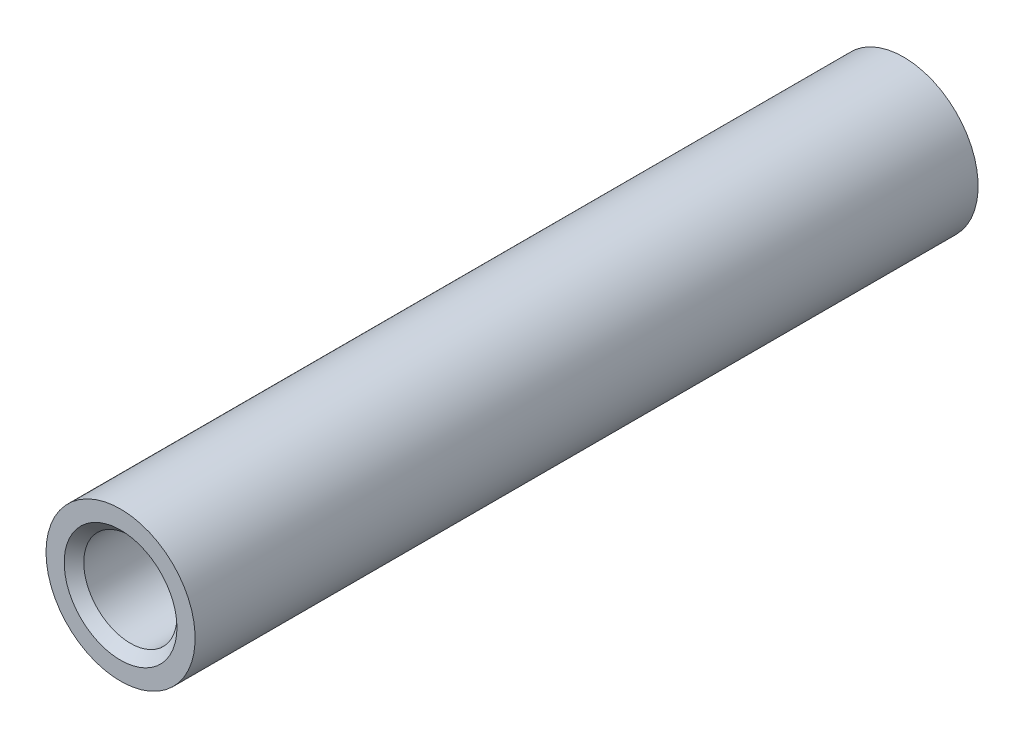
ISO-10303-21;
HEADER;
FILE_DESCRIPTION(('STEP AP214'),'2;1');
FILE_NAME('part.step','',(''),(''),'','','');
FILE_SCHEMA(('AUTOMOTIVE_DESIGN { 1 0 10303 214 1 1 1 1 }'));
ENDSEC;
DATA;
#1=APPLICATION_CONTEXT('core data for automotive mechanical design processes');
#2=APPLICATION_PROTOCOL_DEFINITION('international standard','automotive_design',2000,#1);
#3=PRODUCT_CONTEXT('',#1,'mechanical');
#4=PRODUCT('Part','Part','',(#3));
#5=PRODUCT_RELATED_PRODUCT_CATEGORY('part','',(#4));
#6=PRODUCT_DEFINITION_FORMATION('','',#4);
#7=PRODUCT_DEFINITION_CONTEXT('part definition',#1,'design');
#8=PRODUCT_DEFINITION('design','',#6,#7);
#9=PRODUCT_DEFINITION_SHAPE('','',#8);
#10=(LENGTH_UNIT() NAMED_UNIT(*) SI_UNIT(.MILLI.,.METRE.));
#11=(NAMED_UNIT(*) PLANE_ANGLE_UNIT() SI_UNIT($,.RADIAN.));
#12=(NAMED_UNIT(*) SI_UNIT($,.STERADIAN.) SOLID_ANGLE_UNIT());
#13=UNCERTAINTY_MEASURE_WITH_UNIT(LENGTH_MEASURE(1.E-05),#10,'distance_accuracy_value','');
#14=(GEOMETRIC_REPRESENTATION_CONTEXT(3) GLOBAL_UNCERTAINTY_ASSIGNED_CONTEXT((#13)) GLOBAL_UNIT_ASSIGNED_CONTEXT((#10,
#11,#12)) REPRESENTATION_CONTEXT('',''));
#15=CARTESIAN_POINT('',(0.,0.,0.));
#16=DIRECTION('',(0.,0.,1.));
#17=DIRECTION('',(1.,0.,0.));
#18=AXIS2_PLACEMENT_3D('',#15,#16,#17);
#19=CARTESIAN_POINT('',(0.,0.,21.));
#20=DIRECTION('',(0.,0.,-1.));
#21=DIRECTION('',(-1.,0.,0.));
#22=AXIS2_PLACEMENT_3D('',#19,#20,#21);
#23=CYLINDRICAL_SURFACE('',#22,4.);
#24=CARTESIAN_POINT('',(0.,0.,21.));
#25=DIRECTION('',(0.,0.,1.));
#26=DIRECTION('',(1.,0.,0.));
#27=AXIS2_PLACEMENT_3D('',#24,#25,#26);
#28=CIRCLE('',#27,4.);
#29=CARTESIAN_POINT('',(-4.,0.,21.));
#30=VERTEX_POINT('',#29);
#31=EDGE_CURVE('E11',#30,#30,#28,.T.);
#32=CARTESIAN_POINT('',(0.,0.,-21.));
#33=DIRECTION('',(0.,0.,1.));
#34=DIRECTION('',(1.,0.,0.));
#35=AXIS2_PLACEMENT_3D('',#32,#33,#34);
#36=CIRCLE('',#35,4.);
#37=CARTESIAN_POINT('',(-4.,0.,-21.));
#38=VERTEX_POINT('',#37);
#39=EDGE_CURVE('E39',#38,#38,#36,.T.);
#40=CARTESIAN_POINT('',(-4.,0.,21.));
#41=CARTESIAN_POINT('',(-4.,0.,20.5625));
#42=CARTESIAN_POINT('',(-4.,0.,20.125));
#43=CARTESIAN_POINT('',(-4.,0.,19.25));
#44=CARTESIAN_POINT('',(-4.,0.,18.8125));
#45=CARTESIAN_POINT('',(-4.,0.,17.9375));
#46=CARTESIAN_POINT('',(-4.,0.,17.5));
#47=CARTESIAN_POINT('',(-4.,0.,16.625));
#48=CARTESIAN_POINT('',(-4.,0.,16.1875));
#49=CARTESIAN_POINT('',(-4.,0.,15.3125));
#50=CARTESIAN_POINT('',(-4.,0.,14.875));
#51=CARTESIAN_POINT('',(-4.,0.,14.));
#52=CARTESIAN_POINT('',(-4.,0.,13.5625));
#53=CARTESIAN_POINT('',(-4.,0.,12.6875));
#54=CARTESIAN_POINT('',(-4.,0.,12.25));
#55=CARTESIAN_POINT('',(-4.,0.,11.375));
#56=CARTESIAN_POINT('',(-4.,0.,10.9375));
#57=CARTESIAN_POINT('',(-4.,0.,10.0625));
#58=CARTESIAN_POINT('',(-4.,0.,9.625));
#59=CARTESIAN_POINT('',(-4.,0.,8.75));
#60=CARTESIAN_POINT('',(-4.,0.,8.3125));
#61=CARTESIAN_POINT('',(-4.,0.,7.4375));
#62=CARTESIAN_POINT('',(-4.,0.,7.));
#63=CARTESIAN_POINT('',(-4.,0.,6.125));
#64=CARTESIAN_POINT('',(-4.,0.,5.6875));
#65=CARTESIAN_POINT('',(-4.,0.,4.8125));
#66=CARTESIAN_POINT('',(-4.,0.,4.375));
#67=CARTESIAN_POINT('',(-4.,0.,3.5));
#68=CARTESIAN_POINT('',(-4.,0.,3.0625));
#69=CARTESIAN_POINT('',(-4.,0.,2.1875));
#70=CARTESIAN_POINT('',(-4.,0.,1.75));
#71=CARTESIAN_POINT('',(-4.,0.,0.875000000000001));
#72=CARTESIAN_POINT('',(-4.,0.,0.4375));
#73=CARTESIAN_POINT('',(-4.,0.,-0.4375));
#74=CARTESIAN_POINT('',(-4.,0.,-0.875000000000001));
#75=CARTESIAN_POINT('',(-4.,0.,-1.75));
#76=CARTESIAN_POINT('',(-4.,0.,-2.1875));
#77=CARTESIAN_POINT('',(-4.,0.,-3.0625));
#78=CARTESIAN_POINT('',(-4.,0.,-3.5));
#79=CARTESIAN_POINT('',(-4.,0.,-4.375));
#80=CARTESIAN_POINT('',(-4.,0.,-4.8125));
#81=CARTESIAN_POINT('',(-4.,0.,-5.6875));
#82=CARTESIAN_POINT('',(-4.,0.,-6.125));
#83=CARTESIAN_POINT('',(-4.,0.,-7.));
#84=CARTESIAN_POINT('',(-4.,0.,-7.4375));
#85=CARTESIAN_POINT('',(-4.,0.,-8.3125));
#86=CARTESIAN_POINT('',(-4.,0.,-8.75));
#87=CARTESIAN_POINT('',(-4.,0.,-9.625));
#88=CARTESIAN_POINT('',(-4.,0.,-10.0625));
#89=CARTESIAN_POINT('',(-4.,0.,-10.9375));
#90=CARTESIAN_POINT('',(-4.,0.,-11.375));
#91=CARTESIAN_POINT('',(-4.,0.,-12.25));
#92=CARTESIAN_POINT('',(-4.,0.,-12.6875));
#93=CARTESIAN_POINT('',(-4.,0.,-13.5625));
#94=CARTESIAN_POINT('',(-4.,0.,-14.));
#95=CARTESIAN_POINT('',(-4.,0.,-14.875));
#96=CARTESIAN_POINT('',(-4.,0.,-15.3125));
#97=CARTESIAN_POINT('',(-4.,0.,-16.1875));
#98=CARTESIAN_POINT('',(-4.,0.,-16.625));
#99=CARTESIAN_POINT('',(-4.,0.,-17.5));
#100=CARTESIAN_POINT('',(-4.,0.,-17.9375));
#101=CARTESIAN_POINT('',(-4.,0.,-18.8125));
#102=CARTESIAN_POINT('',(-4.,0.,-19.25));
#103=CARTESIAN_POINT('',(-4.,0.,-20.125));
#104=CARTESIAN_POINT('',(-4.,0.,-20.5625));
#105=CARTESIAN_POINT('',(-4.,0.,-21.));
#106=B_SPLINE_CURVE_WITH_KNOTS('',3,(#40,#41,#42,#43,#44,#45,#46,#47,#48,#49,#50,#51,#52,#53,
#54,#55,#56,#57,#58,#59,#60,#61,#62,#63,#64,#65,#66,#67,#68,#69,#70,#71,#72,#73,#74,#75,#76,#77,
#78,#79,#80,#81,#82,#83,#84,#85,#86,#87,#88,#89,#90,#91,#92,#93,#94,#95,#96,#97,#98,#99,#100,
#101,#102,#103,#104,#105),.UNSPECIFIED.,.F.,.F.,(4,2,2,2,2,2,2,2,2,2,2,2,2,2,2,2,2,2,2,2,2,2,2,
2,2,2,2,2,2,2,2,2,4),(0.,1.3125,2.625,3.9375,5.25,6.5625,7.875,9.1875,10.5,11.8125,13.125,
14.4375,15.75,17.0625,18.375,19.6875,21.,22.3125,23.625,24.9375,26.25,27.5625,28.875,30.1875,
31.5,32.8125,34.125,35.4375,36.75,38.0625,39.375,40.6875,42.),.UNSPECIFIED.);
#107=EDGE_CURVE('BSEAM36',#30,#38,#106,.T.);
#108=ORIENTED_EDGE('',*,*,#31,.F.);
#109=ORIENTED_EDGE('',*,*,#39,.T.);
#110=ORIENTED_EDGE('',*,*,#107,.T.);
#111=ORIENTED_EDGE('',*,*,#107,.F.);
#112=EDGE_LOOP('',(#108,#110,#109,#111));
#113=FACE_BOUND('',#112,.T.);
#114=ADVANCED_FACE('F36',(#113),#23,.T.);
#115=CARTESIAN_POINT('',(0.,0.,21.));
#116=DIRECTION('',(0.,0.,1.));
#117=DIRECTION('',(1.,0.,0.));
#118=AXIS2_PLACEMENT_3D('',#115,#116,#117);
#119=PLANE('',#118);
#120=CARTESIAN_POINT('',(0.,0.,21.));
#121=DIRECTION('',(0.,0.,1.));
#122=DIRECTION('',(1.,0.,0.));
#123=AXIS2_PLACEMENT_3D('',#120,#121,#122);
#124=CIRCLE('',#123,3.025);
#125=CARTESIAN_POINT('',(3.025,0.,21.));
#126=VERTEX_POINT('',#125);
#127=EDGE_CURVE('E59',#126,#126,#124,.T.);
#128=ORIENTED_EDGE('',*,*,#127,.F.);
#129=EDGE_LOOP('',(#128));
#130=FACE_BOUND('',#129,.T.);
#131=ORIENTED_EDGE('',*,*,#31,.T.);
#132=EDGE_LOOP('',(#131));
#133=FACE_BOUND('',#132,.T.);
#134=ADVANCED_FACE('F83',(#130,#133),#119,.T.);
#135=CARTESIAN_POINT('',(0.,0.,-21.));
#136=DIRECTION('',(0.,0.,1.));
#137=DIRECTION('',(1.,0.,0.));
#138=AXIS2_PLACEMENT_3D('',#135,#136,#137);
#139=PLANE('',#138);
#140=CARTESIAN_POINT('',(0.,0.,-21.));
#141=DIRECTION('',(0.,0.,-1.));
#142=DIRECTION('',(-1.,0.,0.));
#143=AXIS2_PLACEMENT_3D('',#140,#141,#142);
#144=CIRCLE('',#143,3.025);
#145=CARTESIAN_POINT('',(-3.025,0.,-21.));
#146=VERTEX_POINT('',#145);
#147=EDGE_CURVE('E66',#146,#146,#144,.T.);
#148=ORIENTED_EDGE('',*,*,#147,.F.);
#149=EDGE_LOOP('',(#148));
#150=FACE_BOUND('',#149,.T.);
#151=ORIENTED_EDGE('',*,*,#39,.F.);
#152=EDGE_LOOP('',(#151));
#153=FACE_BOUND('',#152,.T.);
#154=ADVANCED_FACE('F80',(#150,#153),#139,.F.);
#155=CARTESIAN_POINT('',(0.,0.,6.));
#156=DIRECTION('',(0.,0.,1.));
#157=DIRECTION('',(1.,0.,0.));
#158=AXIS2_PLACEMENT_3D('',#155,#156,#157);
#159=CONICAL_SURFACE('',#158,2.5,1.02974425867665);
#160=CARTESIAN_POINT('',(0.,0.,4.4978484524311));
#161=VERTEX_POINT('',#160);
#162=VERTEX_LOOP('',#161);
#163=FACE_BOUND('',#162,.T.);
#164=CARTESIAN_POINT('',(0.,0.,6.));
#165=DIRECTION('',(0.,0.,1.));
#166=DIRECTION('',(1.,0.,0.));
#167=AXIS2_PLACEMENT_3D('',#164,#165,#166);
#168=CIRCLE('',#167,2.5);
#169=CARTESIAN_POINT('',(2.5,0.,6.));
#170=VERTEX_POINT('',#169);
#171=EDGE_CURVE('E72',#170,#170,#168,.T.);
#172=ORIENTED_EDGE('',*,*,#171,.T.);
#173=EDGE_LOOP('',(#172));
#174=FACE_BOUND('',#173,.T.);
#175=ADVANCED_FACE('F82',(#163,#174),#159,.F.);
#176=CARTESIAN_POINT('',(0.,0.,21.));
#177=DIRECTION('',(0.,0.,1.));
#178=DIRECTION('',(1.,0.,0.));
#179=AXIS2_PLACEMENT_3D('',#176,#177,#178);
#180=CYLINDRICAL_SURFACE('',#179,2.5);
#181=ORIENTED_EDGE('',*,*,#171,.F.);
#182=EDGE_LOOP('',(#181));
#183=FACE_BOUND('',#182,.T.);
#184=CARTESIAN_POINT('',(0.,0.,20.475));
#185=DIRECTION('',(0.,0.,1.));
#186=DIRECTION('',(1.,0.,0.));
#187=AXIS2_PLACEMENT_3D('',#184,#185,#186);
#188=CIRCLE('',#187,2.5);
#189=CARTESIAN_POINT('',(2.5,0.,20.475));
#190=VERTEX_POINT('',#189);
#191=EDGE_CURVE('E63',#190,#190,#188,.T.);
#192=ORIENTED_EDGE('',*,*,#191,.T.);
#193=EDGE_LOOP('',(#192));
#194=FACE_BOUND('',#193,.T.);
#195=ADVANCED_FACE('F89',(#183,#194),#180,.F.);
#196=CARTESIAN_POINT('',(0.,0.,21.));
#197=DIRECTION('',(0.,0.,1.));
#198=DIRECTION('',(1.,0.,0.));
#199=AXIS2_PLACEMENT_3D('',#196,#197,#198);
#200=CONICAL_SURFACE('',#199,3.025,0.785398163397449);
#201=ORIENTED_EDGE('',*,*,#191,.F.);
#202=EDGE_LOOP('',(#201));
#203=FACE_BOUND('',#202,.T.);
#204=ORIENTED_EDGE('',*,*,#127,.T.);
#205=EDGE_LOOP('',(#204));
#206=FACE_BOUND('',#205,.T.);
#207=ADVANCED_FACE('F53',(#203,#206),#200,.F.);
#208=CARTESIAN_POINT('',(0.,0.,-6.));
#209=DIRECTION('',(0.,0.,-1.));
#210=DIRECTION('',(-1.,0.,0.));
#211=AXIS2_PLACEMENT_3D('',#208,#209,#210);
#212=CONICAL_SURFACE('',#211,2.5,1.02974425867665);
#213=CARTESIAN_POINT('',(0.,0.,-4.4978484524311));
#214=VERTEX_POINT('',#213);
#215=VERTEX_LOOP('',#214);
#216=FACE_BOUND('',#215,.T.);
#217=CARTESIAN_POINT('',(0.,0.,-6.));
#218=DIRECTION('',(0.,0.,-1.));
#219=DIRECTION('',(-1.,0.,0.));
#220=AXIS2_PLACEMENT_3D('',#217,#218,#219);
#221=CIRCLE('',#220,2.5);
#222=CARTESIAN_POINT('',(-2.5,0.,-6.));
#223=VERTEX_POINT('',#222);
#224=EDGE_CURVE('E57',#223,#223,#221,.T.);
#225=ORIENTED_EDGE('',*,*,#224,.T.);
#226=EDGE_LOOP('',(#225));
#227=FACE_BOUND('',#226,.T.);
#228=ADVANCED_FACE('F49',(#216,#227),#212,.F.);
#229=CARTESIAN_POINT('',(0.,0.,-21.));
#230=DIRECTION('',(0.,0.,-1.));
#231=DIRECTION('',(-1.,0.,0.));
#232=AXIS2_PLACEMENT_3D('',#229,#230,#231);
#233=CYLINDRICAL_SURFACE('',#232,2.5);
#234=ORIENTED_EDGE('',*,*,#224,.F.);
#235=EDGE_LOOP('',(#234));
#236=FACE_BOUND('',#235,.T.);
#237=CARTESIAN_POINT('',(0.,0.,-20.475));
#238=DIRECTION('',(0.,0.,-1.));
#239=DIRECTION('',(-1.,0.,0.));
#240=AXIS2_PLACEMENT_3D('',#237,#238,#239);
#241=CIRCLE('',#240,2.5);
#242=CARTESIAN_POINT('',(-2.5,0.,-20.475));
#243=VERTEX_POINT('',#242);
#244=EDGE_CURVE('E60',#243,#243,#241,.T.);
#245=ORIENTED_EDGE('',*,*,#244,.T.);
#246=EDGE_LOOP('',(#245));
#247=FACE_BOUND('',#246,.T.);
#248=ADVANCED_FACE('F52',(#236,#247),#233,.F.);
#249=CARTESIAN_POINT('',(0.,0.,-21.));
#250=DIRECTION('',(0.,0.,-1.));
#251=DIRECTION('',(-1.,0.,0.));
#252=AXIS2_PLACEMENT_3D('',#249,#250,#251);
#253=CONICAL_SURFACE('',#252,3.025,0.785398163397449);
#254=ORIENTED_EDGE('',*,*,#244,.F.);
#255=EDGE_LOOP('',(#254));
#256=FACE_BOUND('',#255,.T.);
#257=ORIENTED_EDGE('',*,*,#147,.T.);
#258=EDGE_LOOP('',(#257));
#259=FACE_BOUND('',#258,.T.);
#260=ADVANCED_FACE('F150',(#256,#259),#253,.F.);
#261=CLOSED_SHELL('',(#114,#134,#154,#175,#195,#207,#228,#248,#260));
#262=MANIFOLD_SOLID_BREP('B2',#261);
#263=ADVANCED_BREP_SHAPE_REPRESENTATION('',(#18,#262),#14);
#264=SHAPE_DEFINITION_REPRESENTATION(#9,#263);
ENDSEC;
END-ISO-10303-21;
